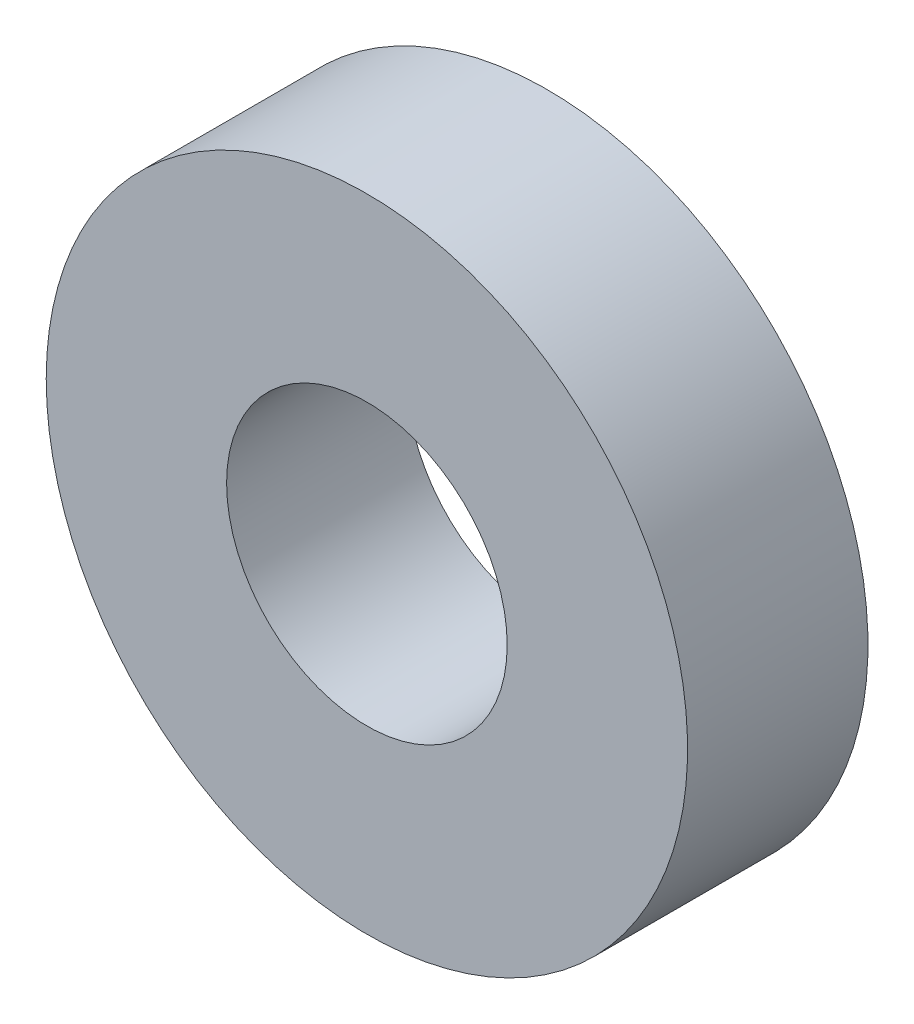
ISO-10303-21;
HEADER;
FILE_DESCRIPTION(('STEP AP214'),'2;1');
FILE_NAME('part.step','',(''),(''),'','','');
FILE_SCHEMA(('AUTOMOTIVE_DESIGN { 1 0 10303 214 1 1 1 1 }'));
ENDSEC;
DATA;
#1=APPLICATION_CONTEXT('core data for automotive mechanical design processes');
#2=APPLICATION_PROTOCOL_DEFINITION('international standard','automotive_design',2000,#1);
#3=PRODUCT_CONTEXT('',#1,'mechanical');
#4=PRODUCT('Part','Part','',(#3));
#5=PRODUCT_RELATED_PRODUCT_CATEGORY('part','',(#4));
#6=PRODUCT_DEFINITION_FORMATION('','',#4);
#7=PRODUCT_DEFINITION_CONTEXT('part definition',#1,'design');
#8=PRODUCT_DEFINITION('design','',#6,#7);
#9=PRODUCT_DEFINITION_SHAPE('','',#8);
#10=(LENGTH_UNIT() NAMED_UNIT(*) SI_UNIT(.MILLI.,.METRE.));
#11=(NAMED_UNIT(*) PLANE_ANGLE_UNIT() SI_UNIT($,.RADIAN.));
#12=(NAMED_UNIT(*) SI_UNIT($,.STERADIAN.) SOLID_ANGLE_UNIT());
#13=UNCERTAINTY_MEASURE_WITH_UNIT(LENGTH_MEASURE(1.E-05),#10,'distance_accuracy_value','');
#14=(GEOMETRIC_REPRESENTATION_CONTEXT(3) GLOBAL_UNCERTAINTY_ASSIGNED_CONTEXT((#13)) GLOBAL_UNIT_ASSIGNED_CONTEXT((#10,
#11,#12)) REPRESENTATION_CONTEXT('',''));
#15=CARTESIAN_POINT('',(0.,0.,0.));
#16=DIRECTION('',(0.,0.,1.));
#17=DIRECTION('',(1.,0.,0.));
#18=AXIS2_PLACEMENT_3D('',#15,#16,#17);
#19=CARTESIAN_POINT('',(0.,0.,0.));
#20=DIRECTION('',(0.,0.,1.));
#21=DIRECTION('',(1.,0.,0.));
#22=AXIS2_PLACEMENT_3D('',#19,#20,#21);
#23=PLANE('',#22);
#24=CARTESIAN_POINT('',(0.,0.,0.));
#25=DIRECTION('',(0.,0.,-1.));
#26=DIRECTION('',(-1.,0.,0.));
#27=AXIS2_PLACEMENT_3D('',#24,#25,#26);
#28=CIRCLE('',#27,7.);
#29=CARTESIAN_POINT('',(-7.,0.,0.));
#30=VERTEX_POINT('',#29);
#31=EDGE_CURVE('E26',#30,#30,#28,.F.);
#32=ORIENTED_EDGE('',*,*,#31,.T.);
#33=EDGE_LOOP('',(#32));
#34=FACE_BOUND('',#33,.T.);
#35=CARTESIAN_POINT('',(0.,0.,0.));
#36=DIRECTION('',(0.,0.,-1.));
#37=DIRECTION('',(-1.,0.,0.));
#38=AXIS2_PLACEMENT_3D('',#35,#36,#37);
#39=CIRCLE('',#38,16.);
#40=CARTESIAN_POINT('',(-16.,0.,0.));
#41=VERTEX_POINT('',#40);
#42=EDGE_CURVE('E17',#41,#41,#39,.F.);
#43=ORIENTED_EDGE('',*,*,#42,.F.);
#44=EDGE_LOOP('',(#43));
#45=FACE_BOUND('',#44,.T.);
#46=ADVANCED_FACE('F14',(#34,#45),#23,.F.);
#47=CARTESIAN_POINT('',(0.,0.,9.));
#48=DIRECTION('',(0.,0.,-1.));
#49=DIRECTION('',(-1.,0.,0.));
#50=AXIS2_PLACEMENT_3D('',#47,#48,#49);
#51=CYLINDRICAL_SURFACE('',#50,16.);
#52=ORIENTED_EDGE('',*,*,#42,.T.);
#53=EDGE_LOOP('',(#52));
#54=FACE_BOUND('',#53,.T.);
#55=CARTESIAN_POINT('',(0.,0.,9.));
#56=DIRECTION('',(0.,0.,-1.));
#57=DIRECTION('',(-1.,0.,0.));
#58=AXIS2_PLACEMENT_3D('',#55,#56,#57);
#59=CIRCLE('',#58,16.);
#60=CARTESIAN_POINT('',(-16.,0.,9.));
#61=VERTEX_POINT('',#60);
#62=EDGE_CURVE('E21',#61,#61,#59,.F.);
#63=ORIENTED_EDGE('',*,*,#62,.F.);
#64=EDGE_LOOP('',(#63));
#65=FACE_BOUND('',#64,.T.);
#66=ADVANCED_FACE('F34',(#54,#65),#51,.T.);
#67=CARTESIAN_POINT('',(0.,0.,9.));
#68=DIRECTION('',(0.,0.,-1.));
#69=DIRECTION('',(-1.,0.,0.));
#70=AXIS2_PLACEMENT_3D('',#67,#68,#69);
#71=CYLINDRICAL_SURFACE('',#70,7.);
#72=CARTESIAN_POINT('',(0.,0.,9.));
#73=DIRECTION('',(0.,0.,-1.));
#74=DIRECTION('',(-1.,0.,0.));
#75=AXIS2_PLACEMENT_3D('',#72,#73,#74);
#76=CIRCLE('',#75,7.);
#77=CARTESIAN_POINT('',(-7.,0.,9.));
#78=VERTEX_POINT('',#77);
#79=EDGE_CURVE('E10',#78,#78,#76,.T.);
#80=ORIENTED_EDGE('',*,*,#79,.F.);
#81=EDGE_LOOP('',(#80));
#82=FACE_BOUND('',#81,.T.);
#83=ORIENTED_EDGE('',*,*,#31,.F.);
#84=EDGE_LOOP('',(#83));
#85=FACE_BOUND('',#84,.T.);
#86=ADVANCED_FACE('F42',(#82,#85),#71,.F.);
#87=CARTESIAN_POINT('',(0.,0.,9.));
#88=DIRECTION('',(0.,0.,1.));
#89=DIRECTION('',(1.,0.,0.));
#90=AXIS2_PLACEMENT_3D('',#87,#88,#89);
#91=PLANE('',#90);
#92=ORIENTED_EDGE('',*,*,#79,.T.);
#93=EDGE_LOOP('',(#92));
#94=FACE_BOUND('',#93,.T.);
#95=ORIENTED_EDGE('',*,*,#62,.T.);
#96=EDGE_LOOP('',(#95));
#97=FACE_BOUND('',#96,.T.);
#98=ADVANCED_FACE('F43',(#94,#97),#91,.T.);
#99=CLOSED_SHELL('',(#46,#66,#86,#98));
#100=MANIFOLD_SOLID_BREP('B1',#99);
#101=ADVANCED_BREP_SHAPE_REPRESENTATION('',(#18,#100),#14);
#102=SHAPE_DEFINITION_REPRESENTATION(#9,#101);
ENDSEC;
END-ISO-10303-21;
